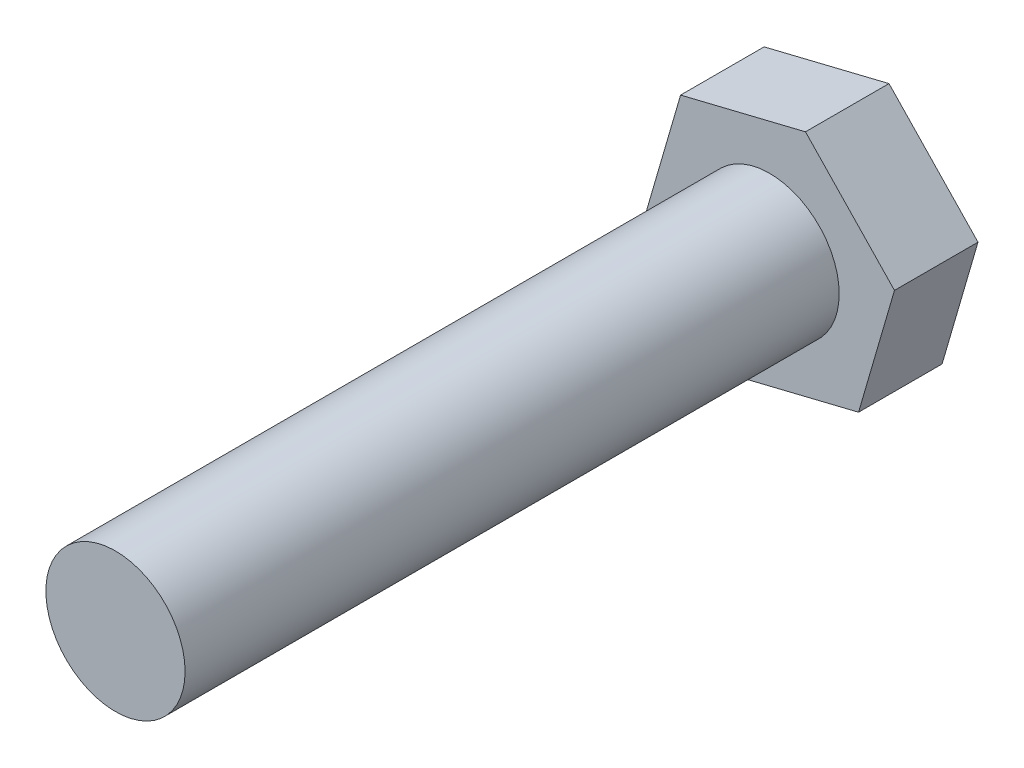
ISO-10303-21;
HEADER;
FILE_DESCRIPTION(('STEP AP214'),'2;1');
FILE_NAME('part.step','',(''),(''),'','','');
FILE_SCHEMA(('AUTOMOTIVE_DESIGN { 1 0 10303 214 1 1 1 1 }'));
ENDSEC;
DATA;
#1=APPLICATION_CONTEXT('core data for automotive mechanical design processes');
#2=APPLICATION_PROTOCOL_DEFINITION('international standard','automotive_design',2000,#1);
#3=PRODUCT_CONTEXT('',#1,'mechanical');
#4=PRODUCT('Part','Part','',(#3));
#5=PRODUCT_RELATED_PRODUCT_CATEGORY('part','',(#4));
#6=PRODUCT_DEFINITION_FORMATION('','',#4);
#7=PRODUCT_DEFINITION_CONTEXT('part definition',#1,'design');
#8=PRODUCT_DEFINITION('design','',#6,#7);
#9=PRODUCT_DEFINITION_SHAPE('','',#8);
#10=(LENGTH_UNIT() NAMED_UNIT(*) SI_UNIT(.MILLI.,.METRE.));
#11=(NAMED_UNIT(*) PLANE_ANGLE_UNIT() SI_UNIT($,.RADIAN.));
#12=(NAMED_UNIT(*) SI_UNIT($,.STERADIAN.) SOLID_ANGLE_UNIT());
#13=UNCERTAINTY_MEASURE_WITH_UNIT(LENGTH_MEASURE(1.E-05),#10,'distance_accuracy_value','');
#14=(GEOMETRIC_REPRESENTATION_CONTEXT(3) GLOBAL_UNCERTAINTY_ASSIGNED_CONTEXT((#13)) GLOBAL_UNIT_ASSIGNED_CONTEXT((#10,
#11,#12)) REPRESENTATION_CONTEXT('',''));
#15=CARTESIAN_POINT('',(0.,0.,0.));
#16=DIRECTION('',(0.,0.,1.));
#17=DIRECTION('',(1.,0.,0.));
#18=AXIS2_PLACEMENT_3D('',#15,#16,#17);
#19=CARTESIAN_POINT('',(1.29006582959035,4.43498179124297,3.));
#20=DIRECTION('',(0.238213519019037,-0.971212808480493,0.));
#21=DIRECTION('',(0.971212808480493,0.238213519019037,0.));
#22=AXIS2_PLACEMENT_3D('',#19,#20,#21);
#23=PLANE('',#22);
#24=DIRECTION('',(-0.971212808480493,-0.238213519019037,0.));
#25=VECTOR('',#24,1.);
#26=CARTESIAN_POINT('',(1.29006582959035,4.43498179124297,0.));
#27=LINE('',#26,#25);
#28=CARTESIAN_POINT('',(1.29006582959035,4.43498179124297,0.));
#29=VERTEX_POINT('',#28);
#30=CARTESIAN_POINT('',(-3.19577398174265,3.33472067660098,0.));
#31=VERTEX_POINT('',#30);
#32=EDGE_CURVE('E119',#29,#31,#27,.T.);
#33=ORIENTED_EDGE('',*,*,#32,.T.);
#34=DIRECTION('',(0.,0.,-1.));
#35=VECTOR('',#34,1.);
#36=CARTESIAN_POINT('',(-3.19577398174265,3.33472067660098,3.));
#37=LINE('',#36,#35);
#38=CARTESIAN_POINT('',(-3.19577398174265,3.33472067660098,3.));
#39=VERTEX_POINT('',#38);
#40=EDGE_CURVE('E36',#39,#31,#37,.T.);
#41=ORIENTED_EDGE('',*,*,#40,.F.);
#42=DIRECTION('',(-0.971212808480493,-0.238213519019037,0.));
#43=VECTOR('',#42,1.);
#44=CARTESIAN_POINT('',(1.29006582959035,4.43498179124297,3.));
#45=LINE('',#44,#43);
#46=CARTESIAN_POINT('',(1.29006582959035,4.43498179124297,3.));
#47=VERTEX_POINT('',#46);
#48=EDGE_CURVE('E130',#47,#39,#45,.T.);
#49=ORIENTED_EDGE('',*,*,#48,.F.);
#50=DIRECTION('',(0.,0.,-1.));
#51=VECTOR('',#50,1.);
#52=CARTESIAN_POINT('',(1.29006582959035,4.43498179124297,3.));
#53=LINE('',#52,#51);
#54=EDGE_CURVE('E115',#47,#29,#53,.T.);
#55=ORIENTED_EDGE('',*,*,#54,.T.);
#56=EDGE_LOOP('',(#33,#41,#49,#55));
#57=FACE_BOUND('',#56,.T.);
#58=ADVANCED_FACE('F33',(#57),#23,.F.);
#59=CARTESIAN_POINT('',(-3.19577398174265,3.33472067660098,3.));
#60=DIRECTION('',(0.960201724134456,-0.279307445244873,0.));
#61=DIRECTION('',(0.279307445244873,0.960201724134456,0.));
#62=AXIS2_PLACEMENT_3D('',#59,#60,#61);
#63=PLANE('',#62);
#64=DIRECTION('',(-0.279307445244873,-0.960201724134456,0.));
#65=VECTOR('',#64,1.);
#66=CARTESIAN_POINT('',(-3.19577398174265,3.33472067660098,0.));
#67=LINE('',#66,#65);
#68=CARTESIAN_POINT('',(-4.485839811333,-1.100261114642,0.));
#69=VERTEX_POINT('',#68);
#70=EDGE_CURVE('E122',#31,#69,#67,.T.);
#71=ORIENTED_EDGE('',*,*,#70,.T.);
#72=DIRECTION('',(0.,0.,-1.));
#73=VECTOR('',#72,1.);
#74=CARTESIAN_POINT('',(-4.485839811333,-1.100261114642,3.));
#75=LINE('',#74,#73);
#76=CARTESIAN_POINT('',(-4.485839811333,-1.100261114642,3.));
#77=VERTEX_POINT('',#76);
#78=EDGE_CURVE('E133',#77,#69,#75,.T.);
#79=ORIENTED_EDGE('',*,*,#78,.F.);
#80=DIRECTION('',(-0.279307445244873,-0.960201724134456,0.));
#81=VECTOR('',#80,1.);
#82=CARTESIAN_POINT('',(-3.19577398174265,3.33472067660098,3.));
#83=LINE('',#82,#81);
#84=EDGE_CURVE('E88',#39,#77,#83,.T.);
#85=ORIENTED_EDGE('',*,*,#84,.F.);
#86=ORIENTED_EDGE('',*,*,#40,.T.);
#87=EDGE_LOOP('',(#71,#79,#85,#86));
#88=FACE_BOUND('',#87,.T.);
#89=ADVANCED_FACE('F138',(#88),#63,.F.);
#90=CARTESIAN_POINT('',(-4.485839811333,-1.100261114642,3.));
#91=DIRECTION('',(0.721988205115419,0.69190536323562,0.));
#92=DIRECTION('',(-0.691905363235621,0.721988205115419,0.));
#93=AXIS2_PLACEMENT_3D('',#90,#91,#92);
#94=PLANE('',#93);
#95=DIRECTION('',(0.691905363235621,-0.721988205115419,0.));
#96=VECTOR('',#95,1.);
#97=CARTESIAN_POINT('',(-4.485839811333,-1.100261114642,0.));
#98=LINE('',#97,#96);
#99=CARTESIAN_POINT('',(-1.29006582959035,-4.43498179124297,0.));
#100=VERTEX_POINT('',#99);
#101=EDGE_CURVE('E125',#69,#100,#98,.T.);
#102=ORIENTED_EDGE('',*,*,#101,.T.);
#103=DIRECTION('',(0.,0.,-1.));
#104=VECTOR('',#103,1.);
#105=CARTESIAN_POINT('',(-1.29006582959035,-4.43498179124297,3.));
#106=LINE('',#105,#104);
#107=CARTESIAN_POINT('',(-1.29006582959035,-4.43498179124297,3.));
#108=VERTEX_POINT('',#107);
#109=EDGE_CURVE('E110',#108,#100,#106,.T.);
#110=ORIENTED_EDGE('',*,*,#109,.F.);
#111=DIRECTION('',(0.691905363235621,-0.721988205115419,0.));
#112=VECTOR('',#111,1.);
#113=CARTESIAN_POINT('',(-4.485839811333,-1.100261114642,3.));
#114=LINE('',#113,#112);
#115=EDGE_CURVE('E101',#77,#108,#114,.T.);
#116=ORIENTED_EDGE('',*,*,#115,.F.);
#117=ORIENTED_EDGE('',*,*,#78,.T.);
#118=EDGE_LOOP('',(#102,#110,#116,#117));
#119=FACE_BOUND('',#118,.T.);
#120=ADVANCED_FACE('F144',(#119),#94,.F.);
#121=CARTESIAN_POINT('',(-1.29006582959035,-4.43498179124297,3.));
#122=DIRECTION('',(-0.238213519019037,0.971212808480493,0.));
#123=DIRECTION('',(-0.971212808480493,-0.238213519019037,0.));
#124=AXIS2_PLACEMENT_3D('',#121,#122,#123);
#125=PLANE('',#124);
#126=DIRECTION('',(0.971212808480493,0.238213519019037,0.));
#127=VECTOR('',#126,1.);
#128=CARTESIAN_POINT('',(-1.29006582959035,-4.43498179124297,0.));
#129=LINE('',#128,#127);
#130=CARTESIAN_POINT('',(3.19577398174265,-3.33472067660098,0.));
#131=VERTEX_POINT('',#130);
#132=EDGE_CURVE('E109',#100,#131,#129,.T.);
#133=ORIENTED_EDGE('',*,*,#132,.T.);
#134=DIRECTION('',(0.,0.,-1.));
#135=VECTOR('',#134,1.);
#136=CARTESIAN_POINT('',(3.19577398174265,-3.33472067660098,3.));
#137=LINE('',#136,#135);
#138=CARTESIAN_POINT('',(3.19577398174265,-3.33472067660098,3.));
#139=VERTEX_POINT('',#138);
#140=EDGE_CURVE('E106',#139,#131,#137,.T.);
#141=ORIENTED_EDGE('',*,*,#140,.F.);
#142=DIRECTION('',(0.971212808480493,0.238213519019037,0.));
#143=VECTOR('',#142,1.);
#144=CARTESIAN_POINT('',(-1.29006582959035,-4.43498179124297,3.));
#145=LINE('',#144,#143);
#146=EDGE_CURVE('E95',#108,#139,#145,.T.);
#147=ORIENTED_EDGE('',*,*,#146,.F.);
#148=ORIENTED_EDGE('',*,*,#109,.T.);
#149=EDGE_LOOP('',(#133,#141,#147,#148));
#150=FACE_BOUND('',#149,.T.);
#151=ADVANCED_FACE('F107',(#150),#125,.F.);
#152=CARTESIAN_POINT('',(3.19577398174265,-3.33472067660098,3.));
#153=DIRECTION('',(-0.960201724134456,0.279307445244872,0.));
#154=DIRECTION('',(-0.279307445244873,-0.960201724134456,0.));
#155=AXIS2_PLACEMENT_3D('',#152,#153,#154);
#156=PLANE('',#155);
#157=DIRECTION('',(0.279307445244872,0.960201724134456,0.));
#158=VECTOR('',#157,1.);
#159=CARTESIAN_POINT('',(3.19577398174265,-3.33472067660098,0.));
#160=LINE('',#159,#158);
#161=CARTESIAN_POINT('',(4.485839811333,1.10026111464199,0.));
#162=VERTEX_POINT('',#161);
#163=EDGE_CURVE('E73',#131,#162,#160,.T.);
#164=ORIENTED_EDGE('',*,*,#163,.T.);
#165=DIRECTION('',(0.,0.,-1.));
#166=VECTOR('',#165,1.);
#167=CARTESIAN_POINT('',(4.485839811333,1.10026111464199,3.));
#168=LINE('',#167,#166);
#169=CARTESIAN_POINT('',(4.485839811333,1.10026111464199,3.));
#170=VERTEX_POINT('',#169);
#171=EDGE_CURVE('E111',#170,#162,#168,.T.);
#172=ORIENTED_EDGE('',*,*,#171,.F.);
#173=DIRECTION('',(0.279307445244872,0.960201724134456,0.));
#174=VECTOR('',#173,1.);
#175=CARTESIAN_POINT('',(3.19577398174265,-3.33472067660098,3.));
#176=LINE('',#175,#174);
#177=EDGE_CURVE('E99',#139,#170,#176,.T.);
#178=ORIENTED_EDGE('',*,*,#177,.F.);
#179=ORIENTED_EDGE('',*,*,#140,.T.);
#180=EDGE_LOOP('',(#164,#172,#178,#179));
#181=FACE_BOUND('',#180,.T.);
#182=ADVANCED_FACE('F113',(#181),#156,.F.);
#183=CARTESIAN_POINT('',(4.485839811333,1.10026111464199,3.));
#184=DIRECTION('',(-0.721988205115419,-0.69190536323562,0.));
#185=DIRECTION('',(0.69190536323562,-0.721988205115419,0.));
#186=AXIS2_PLACEMENT_3D('',#183,#184,#185);
#187=PLANE('',#186);
#188=DIRECTION('',(-0.69190536323562,0.721988205115419,0.));
#189=VECTOR('',#188,1.);
#190=CARTESIAN_POINT('',(4.485839811333,1.10026111464199,0.));
#191=LINE('',#190,#189);
#192=EDGE_CURVE('E79',#162,#29,#191,.T.);
#193=ORIENTED_EDGE('',*,*,#192,.T.);
#194=ORIENTED_EDGE('',*,*,#54,.F.);
#195=DIRECTION('',(-0.69190536323562,0.721988205115419,0.));
#196=VECTOR('',#195,1.);
#197=CARTESIAN_POINT('',(4.485839811333,1.10026111464199,3.));
#198=LINE('',#197,#196);
#199=EDGE_CURVE('E50',#170,#47,#198,.T.);
#200=ORIENTED_EDGE('',*,*,#199,.F.);
#201=ORIENTED_EDGE('',*,*,#171,.T.);
#202=EDGE_LOOP('',(#193,#194,#200,#201));
#203=FACE_BOUND('',#202,.T.);
#204=ADVANCED_FACE('F160',(#203),#187,.F.);
#205=CARTESIAN_POINT('',(0.,0.,3.));
#206=DIRECTION('',(0.,0.,1.));
#207=DIRECTION('',(1.,0.,0.));
#208=AXIS2_PLACEMENT_3D('',#205,#206,#207);
#209=PLANE('',#208);
#210=CARTESIAN_POINT('',(0.,0.,3.));
#211=DIRECTION('',(0.,0.,1.));
#212=DIRECTION('',(1.,0.,0.));
#213=AXIS2_PLACEMENT_3D('',#210,#211,#212);
#214=CIRCLE('',#213,2.5);
#215=CARTESIAN_POINT('',(2.5,0.,3.));
#216=VERTEX_POINT('',#215);
#217=EDGE_CURVE('E11',#216,#216,#214,.T.);
#218=ORIENTED_EDGE('',*,*,#217,.F.);
#219=EDGE_LOOP('',(#218));
#220=FACE_BOUND('',#219,.T.);
#221=ORIENTED_EDGE('',*,*,#48,.T.);
#222=ORIENTED_EDGE('',*,*,#84,.T.);
#223=ORIENTED_EDGE('',*,*,#115,.T.);
#224=ORIENTED_EDGE('',*,*,#146,.T.);
#225=ORIENTED_EDGE('',*,*,#177,.T.);
#226=ORIENTED_EDGE('',*,*,#199,.T.);
#227=EDGE_LOOP('',(#221,#222,#223,#224,#225,#226));
#228=FACE_BOUND('',#227,.T.);
#229=ADVANCED_FACE('F97',(#220,#228),#209,.T.);
#230=CARTESIAN_POINT('',(0.,0.,0.));
#231=DIRECTION('',(0.,0.,1.));
#232=DIRECTION('',(1.,0.,0.));
#233=AXIS2_PLACEMENT_3D('',#230,#231,#232);
#234=PLANE('',#233);
#235=ORIENTED_EDGE('',*,*,#32,.F.);
#236=ORIENTED_EDGE('',*,*,#192,.F.);
#237=ORIENTED_EDGE('',*,*,#163,.F.);
#238=ORIENTED_EDGE('',*,*,#132,.F.);
#239=ORIENTED_EDGE('',*,*,#101,.F.);
#240=ORIENTED_EDGE('',*,*,#70,.F.);
#241=EDGE_LOOP('',(#235,#236,#237,#238,#239,#240));
#242=FACE_BOUND('',#241,.T.);
#243=ADVANCED_FACE('F143',(#242),#234,.F.);
#244=CARTESIAN_POINT('',(0.,0.,26.492));
#245=DIRECTION('',(0.,0.,-1.));
#246=DIRECTION('',(-1.,0.,0.));
#247=AXIS2_PLACEMENT_3D('',#244,#245,#246);
#248=CYLINDRICAL_SURFACE('',#247,2.5);
#249=CARTESIAN_POINT('',(0.,0.,26.492));
#250=DIRECTION('',(0.,0.,1.));
#251=DIRECTION('',(1.,0.,0.));
#252=AXIS2_PLACEMENT_3D('',#249,#250,#251);
#253=CIRCLE('',#252,2.5);
#254=CARTESIAN_POINT('',(2.5,0.,26.492));
#255=VERTEX_POINT('',#254);
#256=EDGE_CURVE('E123',#255,#255,#253,.T.);
#257=ORIENTED_EDGE('',*,*,#256,.F.);
#258=EDGE_LOOP('',(#257));
#259=FACE_BOUND('',#258,.T.);
#260=ORIENTED_EDGE('',*,*,#217,.T.);
#261=EDGE_LOOP('',(#260));
#262=FACE_BOUND('',#261,.T.);
#263=ADVANCED_FACE('F153',(#259,#262),#248,.T.);
#264=CARTESIAN_POINT('',(0.,0.,26.492));
#265=DIRECTION('',(0.,0.,1.));
#266=DIRECTION('',(1.,0.,0.));
#267=AXIS2_PLACEMENT_3D('',#264,#265,#266);
#268=PLANE('',#267);
#269=ORIENTED_EDGE('',*,*,#256,.T.);
#270=EDGE_LOOP('',(#269));
#271=FACE_BOUND('',#270,.T.);
#272=ADVANCED_FACE('F151',(#271),#268,.T.);
#273=CLOSED_SHELL('',(#58,#89,#120,#151,#182,#204,#229,#243,#263,#272));
#274=MANIFOLD_SOLID_BREP('B2',#273);
#275=ADVANCED_BREP_SHAPE_REPRESENTATION('',(#18,#274),#14);
#276=SHAPE_DEFINITION_REPRESENTATION(#9,#275);
ENDSEC;
END-ISO-10303-21;
